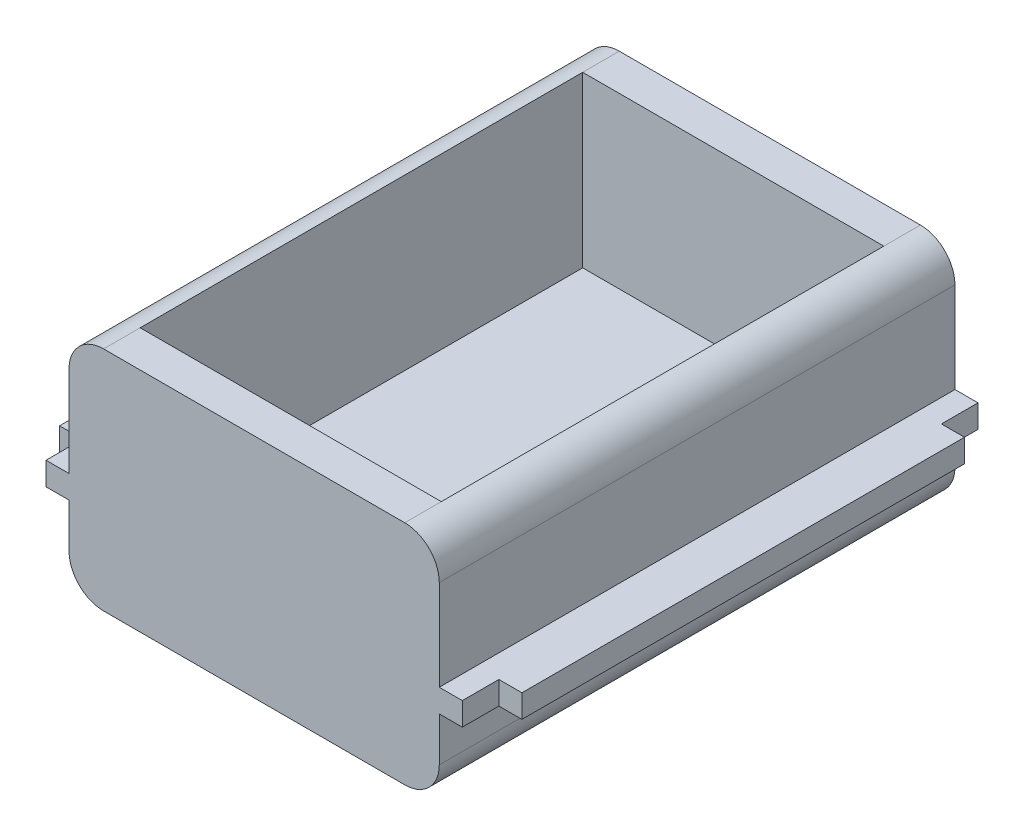
ISO-10303-21;
HEADER;
FILE_DESCRIPTION(('STEP AP214'),'2;1');
FILE_NAME('part.step','',(''),(''),'','','');
FILE_SCHEMA(('AUTOMOTIVE_DESIGN { 1 0 10303 214 1 1 1 1 }'));
ENDSEC;
DATA;
#1=APPLICATION_CONTEXT('core data for automotive mechanical design processes');
#2=APPLICATION_PROTOCOL_DEFINITION('international standard','automotive_design',2000,#1);
#3=PRODUCT_CONTEXT('',#1,'mechanical');
#4=PRODUCT('Part','Part','',(#3));
#5=PRODUCT_RELATED_PRODUCT_CATEGORY('part','',(#4));
#6=PRODUCT_DEFINITION_FORMATION('','',#4);
#7=PRODUCT_DEFINITION_CONTEXT('part definition',#1,'design');
#8=PRODUCT_DEFINITION('design','',#6,#7);
#9=PRODUCT_DEFINITION_SHAPE('','',#8);
#10=(LENGTH_UNIT() NAMED_UNIT(*) SI_UNIT(.MILLI.,.METRE.));
#11=(NAMED_UNIT(*) PLANE_ANGLE_UNIT() SI_UNIT($,.RADIAN.));
#12=(NAMED_UNIT(*) SI_UNIT($,.STERADIAN.) SOLID_ANGLE_UNIT());
#13=UNCERTAINTY_MEASURE_WITH_UNIT(LENGTH_MEASURE(1.E-05),#10,'distance_accuracy_value','');
#14=(GEOMETRIC_REPRESENTATION_CONTEXT(3) GLOBAL_UNCERTAINTY_ASSIGNED_CONTEXT((#13)) GLOBAL_UNIT_ASSIGNED_CONTEXT((#10,
#11,#12)) REPRESENTATION_CONTEXT('',''));
#15=CARTESIAN_POINT('',(0.,0.,0.));
#16=DIRECTION('',(0.,0.,1.));
#17=DIRECTION('',(1.,0.,0.));
#18=AXIS2_PLACEMENT_3D('',#15,#16,#17);
#19=CARTESIAN_POINT('',(18.0681626557431,-1.2537306370674E-13,290.56151375883));
#20=DIRECTION('',(-1.,0.,0.));
#21=DIRECTION('',(0.,-1.,0.));
#22=AXIS2_PLACEMENT_3D('',#19,#20,#21);
#23=PLANE('',#22);
#24=DIRECTION('',(0.,1.,0.));
#25=VECTOR('',#24,1.);
#26=CARTESIAN_POINT('',(18.068162655743,-17.709339043101,296.564940883577));
#27=LINE('',#26,#25);
#28=CARTESIAN_POINT('',(18.0681626557431,4.,296.564940883577));
#29=VERTEX_POINT('',#28);
#30=CARTESIAN_POINT('',(18.0681626557431,5.99999999999999,296.564940883577));
#31=VERTEX_POINT('',#30);
#32=EDGE_CURVE('E68',#29,#31,#27,.T.);
#33=ORIENTED_EDGE('',*,*,#32,.F.);
#34=DIRECTION('',(0.,0.,1.));
#35=VECTOR('',#34,1.);
#36=CARTESIAN_POINT('',(18.0681626557431,4.,290.56151375883));
#37=LINE('',#36,#35);
#38=CARTESIAN_POINT('',(18.0681626557431,4.,293.389940883577));
#39=VERTEX_POINT('',#38);
#40=EDGE_CURVE('E330',#39,#29,#37,.T.);
#41=ORIENTED_EDGE('',*,*,#40,.F.);
#42=DIRECTION('',(0.,-1.,0.));
#43=VECTOR('',#42,1.);
#44=CARTESIAN_POINT('',(18.0681626557431,-1.2537306370674E-13,293.389940883577));
#45=LINE('',#44,#43);
#46=CARTESIAN_POINT('',(18.0681626557432,6.,293.389940883577));
#47=VERTEX_POINT('',#46);
#48=EDGE_CURVE('E232',#47,#39,#45,.T.);
#49=ORIENTED_EDGE('',*,*,#48,.F.);
#50=DIRECTION('',(0.,0.,1.));
#51=VECTOR('',#50,1.);
#52=CARTESIAN_POINT('',(18.0681626557432,6.,290.56151375883));
#53=LINE('',#52,#51);
#54=EDGE_CURVE('E229',#47,#31,#53,.T.);
#55=ORIENTED_EDGE('',*,*,#54,.T.);
#56=EDGE_LOOP('',(#33,#41,#49,#55));
#57=FACE_BOUND('',#56,.T.);
#58=ADVANCED_FACE('F43',(#57),#23,.F.);
#59=CARTESIAN_POINT('',(-18.0681626557431,-1.2537306370674E-13,290.56151375883));
#60=DIRECTION('',(-1.,0.,0.));
#61=DIRECTION('',(0.,-1.,0.));
#62=AXIS2_PLACEMENT_3D('',#59,#60,#61);
#63=PLANE('',#62);
#64=DIRECTION('',(0.,0.,1.));
#65=VECTOR('',#64,1.);
#66=CARTESIAN_POINT('',(-18.0681626557431,4.,290.56151375883));
#67=LINE('',#66,#65);
#68=CARTESIAN_POINT('',(-18.0681626557431,4.,293.389940883577));
#69=VERTEX_POINT('',#68);
#70=CARTESIAN_POINT('',(-18.0681626557431,3.99999999999999,296.564940883577));
#71=VERTEX_POINT('',#70);
#72=EDGE_CURVE('E322',#69,#71,#67,.T.);
#73=ORIENTED_EDGE('',*,*,#72,.T.);
#74=DIRECTION('',(0.,1.,0.));
#75=VECTOR('',#74,1.);
#76=CARTESIAN_POINT('',(-18.068162655743,-17.7093390431007,296.564940883577));
#77=LINE('',#76,#75);
#78=CARTESIAN_POINT('',(-18.0681626557432,6.,296.564940883577));
#79=VERTEX_POINT('',#78);
#80=EDGE_CURVE('E285',#71,#79,#77,.T.);
#81=ORIENTED_EDGE('',*,*,#80,.T.);
#82=DIRECTION('',(0.,0.,1.));
#83=VECTOR('',#82,1.);
#84=CARTESIAN_POINT('',(-18.0681626557432,6.,290.56151375883));
#85=LINE('',#84,#83);
#86=CARTESIAN_POINT('',(-18.0681626557432,6.,293.389940883577));
#87=VERTEX_POINT('',#86);
#88=EDGE_CURVE('E310',#87,#79,#85,.T.);
#89=ORIENTED_EDGE('',*,*,#88,.F.);
#90=DIRECTION('',(0.,-1.,0.));
#91=VECTOR('',#90,1.);
#92=CARTESIAN_POINT('',(-18.0681626557431,-1.2537306370674E-13,293.389940883577));
#93=LINE('',#92,#91);
#94=EDGE_CURVE('E306',#87,#69,#93,.T.);
#95=ORIENTED_EDGE('',*,*,#94,.T.);
#96=EDGE_LOOP('',(#73,#81,#89,#95));
#97=FACE_BOUND('',#96,.T.);
#98=ADVANCED_FACE('F516',(#97),#63,.T.);
#99=CARTESIAN_POINT('',(16.0681626557431,0.,255.695244414574));
#100=DIRECTION('',(1.,0.,0.));
#101=DIRECTION('',(0.,0.,-1.));
#102=AXIS2_PLACEMENT_3D('',#99,#100,#101);
#103=PLANE('',#102);
#104=DIRECTION('',(0.,1.,0.));
#105=VECTOR('',#104,1.);
#106=CARTESIAN_POINT('',(16.0681626557431,0.,338.152440883577));
#107=LINE('',#106,#105);
#108=CARTESIAN_POINT('',(16.0681626557431,6.,338.152440883577));
#109=VERTEX_POINT('',#108);
#110=CARTESIAN_POINT('',(16.0681626557431,13.8673416006033,338.152440883577));
#111=VERTEX_POINT('',#110);
#112=EDGE_CURVE('E393',#109,#111,#107,.T.);
#113=ORIENTED_EDGE('',*,*,#112,.F.);
#114=DIRECTION('',(0.,0.,1.));
#115=VECTOR('',#114,1.);
#116=CARTESIAN_POINT('',(16.0681626557431,6.,290.56151375883));
#117=LINE('',#116,#115);
#118=CARTESIAN_POINT('',(16.0681626557431,6.,293.389940883577));
#119=VERTEX_POINT('',#118);
#120=EDGE_CURVE('E265',#119,#109,#117,.T.);
#121=ORIENTED_EDGE('',*,*,#120,.F.);
#122=DIRECTION('',(0.,1.,0.));
#123=VECTOR('',#122,1.);
#124=CARTESIAN_POINT('',(16.0681626557431,0.,293.389940883577));
#125=LINE('',#124,#123);
#126=CARTESIAN_POINT('',(16.0681626557431,13.8673416006033,293.389940883577));
#127=VERTEX_POINT('',#126);
#128=EDGE_CURVE('E411',#119,#127,#125,.T.);
#129=ORIENTED_EDGE('',*,*,#128,.T.);
#130=DIRECTION('',(0.,0.,1.));
#131=VECTOR('',#130,1.);
#132=CARTESIAN_POINT('',(16.0681626557431,13.8673416006033,255.695244414574));
#133=LINE('',#132,#131);
#134=EDGE_CURVE('E410',#127,#111,#133,.T.);
#135=ORIENTED_EDGE('',*,*,#134,.T.);
#136=EDGE_LOOP('',(#113,#121,#129,#135));
#137=FACE_BOUND('',#136,.T.);
#138=ADVANCED_FACE('F467',(#137),#103,.T.);
#139=CARTESIAN_POINT('',(16.0681626557431,0.165901618597167,293.389940883577));
#140=VERTEX_POINT('',#139);
#141=CARTESIAN_POINT('',(16.0681626557431,4.,293.389940883577));
#142=VERTEX_POINT('',#141);
#143=EDGE_CURVE('E407',#140,#142,#125,.T.);
#144=ORIENTED_EDGE('',*,*,#143,.T.);
#145=DIRECTION('',(0.,0.,1.));
#146=VECTOR('',#145,1.);
#147=CARTESIAN_POINT('',(16.0681626557431,4.,290.56151375883));
#148=LINE('',#147,#146);
#149=CARTESIAN_POINT('',(16.0681626557431,4.,338.152440883577));
#150=VERTEX_POINT('',#149);
#151=EDGE_CURVE('E329',#142,#150,#148,.T.);
#152=ORIENTED_EDGE('',*,*,#151,.T.);
#153=CARTESIAN_POINT('',(16.0681626557431,0.165901618597167,338.152440883577));
#154=VERTEX_POINT('',#153);
#155=EDGE_CURVE('E380',#154,#150,#107,.T.);
#156=ORIENTED_EDGE('',*,*,#155,.F.);
#157=DIRECTION('',(0.,0.,1.));
#158=VECTOR('',#157,1.);
#159=CARTESIAN_POINT('',(16.0681626557431,0.165901618597167,255.695244414574));
#160=LINE('',#159,#158);
#161=EDGE_CURVE('E403',#140,#154,#160,.T.);
#162=ORIENTED_EDGE('',*,*,#161,.F.);
#163=EDGE_LOOP('',(#144,#152,#156,#162));
#164=FACE_BOUND('',#163,.T.);
#165=ADVANCED_FACE('F474',(#164),#103,.T.);
#166=CARTESIAN_POINT('',(-16.0681626557431,0.,255.695244414574));
#167=DIRECTION('',(1.,0.,0.));
#168=DIRECTION('',(0.,0.,-1.));
#169=AXIS2_PLACEMENT_3D('',#166,#167,#168);
#170=PLANE('',#169);
#171=DIRECTION('',(0.,1.,0.));
#172=VECTOR('',#171,1.);
#173=CARTESIAN_POINT('',(-16.0681626557431,0.,338.152440883577));
#174=LINE('',#173,#172);
#175=CARTESIAN_POINT('',(-16.0681626557431,0.165901618597167,338.152440883577));
#176=VERTEX_POINT('',#175);
#177=CARTESIAN_POINT('',(-16.0681626557431,4.,338.152440883577));
#178=VERTEX_POINT('',#177);
#179=EDGE_CURVE('E384',#176,#178,#174,.T.);
#180=ORIENTED_EDGE('',*,*,#179,.T.);
#181=DIRECTION('',(0.,0.,1.));
#182=VECTOR('',#181,1.);
#183=CARTESIAN_POINT('',(-16.0681626557431,4.,290.56151375883));
#184=LINE('',#183,#182);
#185=CARTESIAN_POINT('',(-16.0681626557431,4.,293.389940883577));
#186=VERTEX_POINT('',#185);
#187=EDGE_CURVE('E305',#186,#178,#184,.T.);
#188=ORIENTED_EDGE('',*,*,#187,.F.);
#189=DIRECTION('',(0.,1.,0.));
#190=VECTOR('',#189,1.);
#191=CARTESIAN_POINT('',(-16.0681626557431,0.,293.389940883577));
#192=LINE('',#191,#190);
#193=CARTESIAN_POINT('',(-16.0681626557431,0.165901618597167,293.389940883577));
#194=VERTEX_POINT('',#193);
#195=EDGE_CURVE('E420',#194,#186,#192,.T.);
#196=ORIENTED_EDGE('',*,*,#195,.F.);
#197=DIRECTION('',(0.,0.,1.));
#198=VECTOR('',#197,1.);
#199=CARTESIAN_POINT('',(-16.0681626557431,0.165901618597167,255.695244414574));
#200=LINE('',#199,#198);
#201=EDGE_CURVE('E437',#194,#176,#200,.T.);
#202=ORIENTED_EDGE('',*,*,#201,.T.);
#203=EDGE_LOOP('',(#180,#188,#196,#202));
#204=FACE_BOUND('',#203,.T.);
#205=ADVANCED_FACE('F491',(#204),#170,.F.);
#206=CARTESIAN_POINT('',(0.,16.8673416006033,255.695244414574));
#207=DIRECTION('',(0.,-1.,0.));
#208=DIRECTION('',(0.,0.,-1.));
#209=AXIS2_PLACEMENT_3D('',#206,#207,#208);
#210=PLANE('',#209);
#211=DIRECTION('',(0.,0.,1.));
#212=VECTOR('',#211,1.);
#213=CARTESIAN_POINT('',(13.0681626557431,16.8673416006033,255.695244414574));
#214=LINE('',#213,#212);
#215=CARTESIAN_POINT('',(13.0681626557431,16.8673416006033,334.977440883576));
#216=VERTEX_POINT('',#215);
#217=CARTESIAN_POINT('',(13.0681626557431,16.8673416006033,338.152440883577));
#218=VERTEX_POINT('',#217);
#219=EDGE_CURVE('E427',#216,#218,#214,.T.);
#220=ORIENTED_EDGE('',*,*,#219,.F.);
#221=DIRECTION('',(1.,0.,0.));
#222=VECTOR('',#221,1.);
#223=CARTESIAN_POINT('',(-13.0681626557431,16.8673416006033,334.977440883576));
#224=LINE('',#223,#222);
#225=CARTESIAN_POINT('',(-13.0681626557431,16.8673416006033,334.977440883576));
#226=VERTEX_POINT('',#225);
#227=EDGE_CURVE('E348',#226,#216,#224,.T.);
#228=ORIENTED_EDGE('',*,*,#227,.F.);
#229=DIRECTION('',(0.,0.,1.));
#230=VECTOR('',#229,1.);
#231=CARTESIAN_POINT('',(-13.0681626557431,16.8673416006033,255.695244414574));
#232=LINE('',#231,#230);
#233=CARTESIAN_POINT('',(-13.0681626557431,16.8673416006033,338.152440883577));
#234=VERTEX_POINT('',#233);
#235=EDGE_CURVE('E428',#226,#234,#232,.T.);
#236=ORIENTED_EDGE('',*,*,#235,.T.);
#237=DIRECTION('',(1.,0.,0.));
#238=VECTOR('',#237,1.);
#239=CARTESIAN_POINT('',(0.,16.8673416006033,338.152440883577));
#240=LINE('',#239,#238);
#241=EDGE_CURVE('E376',#234,#218,#240,.T.);
#242=ORIENTED_EDGE('',*,*,#241,.T.);
#243=EDGE_LOOP('',(#220,#228,#236,#242));
#244=FACE_BOUND('',#243,.T.);
#245=ADVANCED_FACE('F585',(#244),#210,.F.);
#246=CARTESIAN_POINT('',(-13.0681626557431,13.8673416006033,255.695244414574));
#247=DIRECTION('',(0.,0.,1.));
#248=DIRECTION('',(1.,0.,0.));
#249=AXIS2_PLACEMENT_3D('',#246,#247,#248);
#250=CYLINDRICAL_SURFACE('',#249,3.);
#251=CARTESIAN_POINT('',(-13.0681626557431,13.8673416006033,293.389940883577));
#252=DIRECTION('',(0.,0.,-1.));
#253=DIRECTION('',(-1.,0.,0.));
#254=AXIS2_PLACEMENT_3D('',#251,#252,#253);
#255=CIRCLE('',#254,3.);
#256=CARTESIAN_POINT('',(-16.0681626557431,13.8673416006033,293.389940883577));
#257=VERTEX_POINT('',#256);
#258=CARTESIAN_POINT('',(-13.0681626557431,16.8673416006033,293.389940883577));
#259=VERTEX_POINT('',#258);
#260=EDGE_CURVE('E417',#257,#259,#255,.T.);
#261=ORIENTED_EDGE('',*,*,#260,.F.);
#262=DIRECTION('',(0.,0.,1.));
#263=VECTOR('',#262,1.);
#264=CARTESIAN_POINT('',(-16.0681626557431,13.8673416006033,255.695244414574));
#265=LINE('',#264,#263);
#266=CARTESIAN_POINT('',(-16.0681626557431,13.8673416006033,338.152440883577));
#267=VERTEX_POINT('',#266);
#268=EDGE_CURVE('E47',#257,#267,#265,.T.);
#269=ORIENTED_EDGE('',*,*,#268,.T.);
#270=CARTESIAN_POINT('',(-13.0681626557431,13.8673416006033,338.152440883577));
#271=DIRECTION('',(0.,0.,1.));
#272=DIRECTION('',(1.,0.,0.));
#273=AXIS2_PLACEMENT_3D('',#270,#271,#272);
#274=CIRCLE('',#273,3.);
#275=EDGE_CURVE('E381',#267,#234,#274,.F.);
#276=ORIENTED_EDGE('',*,*,#275,.T.);
#277=ORIENTED_EDGE('',*,*,#235,.F.);
#278=DIRECTION('',(0.,0.,1.));
#279=VECTOR('',#278,1.);
#280=CARTESIAN_POINT('',(-13.0681626557431,16.8673416006033,296.564940883576));
#281=LINE('',#280,#279);
#282=CARTESIAN_POINT('',(-13.0681626557431,16.8673416006033,296.564940883576));
#283=VERTEX_POINT('',#282);
#284=EDGE_CURVE('E350',#283,#226,#281,.T.);
#285=ORIENTED_EDGE('',*,*,#284,.F.);
#286=EDGE_CURVE('E424',#259,#283,#232,.T.);
#287=ORIENTED_EDGE('',*,*,#286,.F.);
#288=EDGE_LOOP('',(#261,#269,#276,#277,#285,#287));
#289=FACE_BOUND('',#288,.T.);
#290=ADVANCED_FACE('F452',(#289),#250,.T.);
#291=ORIENTED_EDGE('',*,*,#286,.T.);
#292=DIRECTION('',(-1.,0.,0.));
#293=VECTOR('',#292,1.);
#294=CARTESIAN_POINT('',(-13.0681626557431,16.8673416006033,296.564940883576));
#295=LINE('',#294,#293);
#296=CARTESIAN_POINT('',(13.0681626557431,16.8673416006033,296.564940883576));
#297=VERTEX_POINT('',#296);
#298=EDGE_CURVE('E325',#297,#283,#295,.T.);
#299=ORIENTED_EDGE('',*,*,#298,.F.);
#300=CARTESIAN_POINT('',(13.0681626557431,16.8673416006033,293.389940883577));
#301=VERTEX_POINT('',#300);
#302=EDGE_CURVE('E429',#301,#297,#214,.T.);
#303=ORIENTED_EDGE('',*,*,#302,.F.);
#304=DIRECTION('',(1.,0.,0.));
#305=VECTOR('',#304,1.);
#306=CARTESIAN_POINT('',(0.,16.8673416006033,293.389940883577));
#307=LINE('',#306,#305);
#308=EDGE_CURVE('E414',#259,#301,#307,.T.);
#309=ORIENTED_EDGE('',*,*,#308,.F.);
#310=EDGE_LOOP('',(#291,#299,#303,#309));
#311=FACE_BOUND('',#310,.T.);
#312=ADVANCED_FACE('F457',(#311),#210,.F.);
#313=CARTESIAN_POINT('',(13.0681626557431,13.8673416006033,255.695244414574));
#314=DIRECTION('',(0.,0.,1.));
#315=DIRECTION('',(1.,0.,0.));
#316=AXIS2_PLACEMENT_3D('',#313,#314,#315);
#317=CYLINDRICAL_SURFACE('',#316,3.);
#318=CARTESIAN_POINT('',(13.0681626557431,13.8673416006033,293.389940883577));
#319=DIRECTION('',(0.,0.,-1.));
#320=DIRECTION('',(-1.,0.,0.));
#321=AXIS2_PLACEMENT_3D('',#318,#319,#320);
#322=CIRCLE('',#321,3.);
#323=EDGE_CURVE('E406',#301,#127,#322,.T.);
#324=ORIENTED_EDGE('',*,*,#323,.F.);
#325=ORIENTED_EDGE('',*,*,#302,.T.);
#326=DIRECTION('',(0.,0.,-1.));
#327=VECTOR('',#326,1.);
#328=CARTESIAN_POINT('',(13.0681626557431,16.8673416006033,296.564940883576));
#329=LINE('',#328,#327);
#330=EDGE_CURVE('E344',#216,#297,#329,.T.);
#331=ORIENTED_EDGE('',*,*,#330,.F.);
#332=ORIENTED_EDGE('',*,*,#219,.T.);
#333=CARTESIAN_POINT('',(13.0681626557431,13.8673416006033,338.152440883577));
#334=DIRECTION('',(0.,0.,1.));
#335=DIRECTION('',(1.,0.,0.));
#336=AXIS2_PLACEMENT_3D('',#333,#334,#335);
#337=CIRCLE('',#336,3.);
#338=EDGE_CURVE('E379',#218,#111,#337,.F.);
#339=ORIENTED_EDGE('',*,*,#338,.T.);
#340=ORIENTED_EDGE('',*,*,#134,.F.);
#341=EDGE_LOOP('',(#324,#325,#331,#332,#339,#340));
#342=FACE_BOUND('',#341,.T.);
#343=ADVANCED_FACE('F462',(#342),#317,.T.);
#344=CARTESIAN_POINT('',(13.0681626557431,0.165901618597167,255.695244414574));
#345=DIRECTION('',(0.,0.,1.));
#346=DIRECTION('',(1.,0.,0.));
#347=AXIS2_PLACEMENT_3D('',#344,#345,#346);
#348=CYLINDRICAL_SURFACE('',#347,3.);
#349=CARTESIAN_POINT('',(13.0681626557431,0.165901618597167,293.389940883577));
#350=DIRECTION('',(0.,0.,-1.));
#351=DIRECTION('',(-1.,0.,0.));
#352=AXIS2_PLACEMENT_3D('',#349,#350,#351);
#353=CIRCLE('',#352,3.);
#354=CARTESIAN_POINT('',(13.0681626557431,-2.83409838140283,293.389940883577));
#355=VERTEX_POINT('',#354);
#356=EDGE_CURVE('E52',#140,#355,#353,.T.);
#357=ORIENTED_EDGE('',*,*,#356,.F.);
#358=ORIENTED_EDGE('',*,*,#161,.T.);
#359=CARTESIAN_POINT('',(13.0681626557431,0.165901618597167,338.152440883577));
#360=DIRECTION('',(0.,0.,1.));
#361=DIRECTION('',(1.,0.,0.));
#362=AXIS2_PLACEMENT_3D('',#359,#360,#361);
#363=CIRCLE('',#362,3.);
#364=CARTESIAN_POINT('',(13.0681626557431,-2.83409838140283,338.152440883577));
#365=VERTEX_POINT('',#364);
#366=EDGE_CURVE('E390',#154,#365,#363,.F.);
#367=ORIENTED_EDGE('',*,*,#366,.T.);
#368=DIRECTION('',(0.,0.,1.));
#369=VECTOR('',#368,1.);
#370=CARTESIAN_POINT('',(13.0681626557431,-2.83409838140283,255.695244414574));
#371=LINE('',#370,#369);
#372=EDGE_CURVE('E402',#355,#365,#371,.T.);
#373=ORIENTED_EDGE('',*,*,#372,.F.);
#374=EDGE_LOOP('',(#357,#358,#367,#373));
#375=FACE_BOUND('',#374,.T.);
#376=ADVANCED_FACE('F478',(#375),#348,.T.);
#377=CARTESIAN_POINT('',(0.,-2.83409838140283,255.695244414574));
#378=DIRECTION('',(0.,-1.,0.));
#379=DIRECTION('',(0.,0.,-1.));
#380=AXIS2_PLACEMENT_3D('',#377,#378,#379);
#381=PLANE('',#380);
#382=DIRECTION('',(0.,0.,1.));
#383=VECTOR('',#382,1.);
#384=CARTESIAN_POINT('',(-13.0681626557431,-2.83409838140283,255.695244414574));
#385=LINE('',#384,#383);
#386=CARTESIAN_POINT('',(-13.0681626557431,-2.83409838140283,293.389940883577));
#387=VERTEX_POINT('',#386);
#388=CARTESIAN_POINT('',(-13.0681626557431,-2.83409838140283,338.152440883577));
#389=VERTEX_POINT('',#388);
#390=EDGE_CURVE('E436',#387,#389,#385,.T.);
#391=ORIENTED_EDGE('',*,*,#390,.F.);
#392=DIRECTION('',(1.,0.,0.));
#393=VECTOR('',#392,1.);
#394=CARTESIAN_POINT('',(0.,-2.83409838140283,293.389940883577));
#395=LINE('',#394,#393);
#396=EDGE_CURVE('E400',#387,#355,#395,.T.);
#397=ORIENTED_EDGE('',*,*,#396,.T.);
#398=ORIENTED_EDGE('',*,*,#372,.T.);
#399=DIRECTION('',(1.,0.,0.));
#400=VECTOR('',#399,1.);
#401=CARTESIAN_POINT('',(0.,-2.83409838140283,338.152440883577));
#402=LINE('',#401,#400);
#403=EDGE_CURVE('E375',#389,#365,#402,.T.);
#404=ORIENTED_EDGE('',*,*,#403,.F.);
#405=EDGE_LOOP('',(#391,#397,#398,#404));
#406=FACE_BOUND('',#405,.T.);
#407=ADVANCED_FACE('F487',(#406),#381,.T.);
#408=CARTESIAN_POINT('',(-13.0681626557431,0.165901618597167,255.695244414574));
#409=DIRECTION('',(0.,0.,1.));
#410=DIRECTION('',(1.,0.,0.));
#411=AXIS2_PLACEMENT_3D('',#408,#409,#410);
#412=CYLINDRICAL_SURFACE('',#411,3.);
#413=CARTESIAN_POINT('',(-13.0681626557431,0.165901618597167,293.389940883577));
#414=DIRECTION('',(0.,0.,-1.));
#415=DIRECTION('',(-1.,0.,0.));
#416=AXIS2_PLACEMENT_3D('',#413,#414,#415);
#417=CIRCLE('',#416,3.);
#418=EDGE_CURVE('E12',#387,#194,#417,.T.);
#419=ORIENTED_EDGE('',*,*,#418,.F.);
#420=ORIENTED_EDGE('',*,*,#390,.T.);
#421=CARTESIAN_POINT('',(-13.0681626557431,0.165901618597167,338.152440883577));
#422=DIRECTION('',(0.,0.,1.));
#423=DIRECTION('',(1.,0.,0.));
#424=AXIS2_PLACEMENT_3D('',#421,#422,#423);
#425=CIRCLE('',#424,3.);
#426=EDGE_CURVE('E387',#389,#176,#425,.F.);
#427=ORIENTED_EDGE('',*,*,#426,.T.);
#428=ORIENTED_EDGE('',*,*,#201,.F.);
#429=EDGE_LOOP('',(#419,#420,#427,#428));
#430=FACE_BOUND('',#429,.T.);
#431=ADVANCED_FACE('F490',(#430),#412,.T.);
#432=CARTESIAN_POINT('',(-16.0681626557431,5.99999999999999,293.389940883577));
#433=VERTEX_POINT('',#432);
#434=EDGE_CURVE('E423',#433,#257,#192,.T.);
#435=ORIENTED_EDGE('',*,*,#434,.F.);
#436=DIRECTION('',(0.,0.,1.));
#437=VECTOR('',#436,1.);
#438=CARTESIAN_POINT('',(-16.0681626557431,6.,290.56151375883));
#439=LINE('',#438,#437);
#440=CARTESIAN_POINT('',(-16.0681626557431,6.,338.152440883577));
#441=VERTEX_POINT('',#440);
#442=EDGE_CURVE('E315',#433,#441,#439,.T.);
#443=ORIENTED_EDGE('',*,*,#442,.T.);
#444=EDGE_CURVE('E386',#441,#267,#174,.T.);
#445=ORIENTED_EDGE('',*,*,#444,.T.);
#446=ORIENTED_EDGE('',*,*,#268,.F.);
#447=EDGE_LOOP('',(#435,#443,#445,#446));
#448=FACE_BOUND('',#447,.T.);
#449=ADVANCED_FACE('F448',(#448),#170,.F.);
#450=CARTESIAN_POINT('',(-22.376728314293,-17.7093390431007,293.389940883577));
#451=DIRECTION('',(0.,0.,-1.));
#452=DIRECTION('',(-1.,0.,0.));
#453=AXIS2_PLACEMENT_3D('',#450,#451,#452);
#454=PLANE('',#453);
#455=ORIENTED_EDGE('',*,*,#195,.T.);
#456=DIRECTION('',(1.,0.,0.));
#457=VECTOR('',#456,1.);
#458=CARTESIAN_POINT('',(0.,4.,293.389940883577));
#459=LINE('',#458,#457);
#460=EDGE_CURVE('E295',#69,#186,#459,.T.);
#461=ORIENTED_EDGE('',*,*,#460,.F.);
#462=ORIENTED_EDGE('',*,*,#94,.F.);
#463=DIRECTION('',(-1.,0.,0.));
#464=VECTOR('',#463,1.);
#465=CARTESIAN_POINT('',(0.,6.00000000000001,293.389940883577));
#466=LINE('',#465,#464);
#467=EDGE_CURVE('E311',#433,#87,#466,.T.);
#468=ORIENTED_EDGE('',*,*,#467,.F.);
#469=ORIENTED_EDGE('',*,*,#434,.T.);
#470=ORIENTED_EDGE('',*,*,#260,.T.);
#471=ORIENTED_EDGE('',*,*,#308,.T.);
#472=ORIENTED_EDGE('',*,*,#323,.T.);
#473=ORIENTED_EDGE('',*,*,#128,.F.);
#474=DIRECTION('',(1.,0.,0.));
#475=VECTOR('',#474,1.);
#476=CARTESIAN_POINT('',(0.,6.00000000000001,293.389940883577));
#477=LINE('',#476,#475);
#478=EDGE_CURVE('E337',#119,#47,#477,.T.);
#479=ORIENTED_EDGE('',*,*,#478,.T.);
#480=ORIENTED_EDGE('',*,*,#48,.T.);
#481=DIRECTION('',(-1.,0.,0.));
#482=VECTOR('',#481,1.);
#483=CARTESIAN_POINT('',(0.,4.,293.389940883577));
#484=LINE('',#483,#482);
#485=EDGE_CURVE('E302',#39,#142,#484,.T.);
#486=ORIENTED_EDGE('',*,*,#485,.T.);
#487=ORIENTED_EDGE('',*,*,#143,.F.);
#488=ORIENTED_EDGE('',*,*,#356,.T.);
#489=ORIENTED_EDGE('',*,*,#396,.F.);
#490=ORIENTED_EDGE('',*,*,#418,.T.);
#491=EDGE_LOOP('',(#455,#461,#462,#468,#469,#470,#471,#472,#473,#479,#480,#486,#487,#488,#489,#490));
#492=FACE_BOUND('',#491,.T.);
#493=ADVANCED_FACE('F45',(#492),#454,.T.);
#494=CARTESIAN_POINT('',(-1.81043795684957,9.1501579017386,338.152440883577));
#495=DIRECTION('',(0.,0.,1.));
#496=DIRECTION('',(1.,0.,0.));
#497=AXIS2_PLACEMENT_3D('',#494,#495,#496);
#498=PLANE('',#497);
#499=ORIENTED_EDGE('',*,*,#275,.F.);
#500=ORIENTED_EDGE('',*,*,#444,.F.);
#501=DIRECTION('',(-1.,0.,0.));
#502=VECTOR('',#501,1.);
#503=CARTESIAN_POINT('',(0.,6.00000000000001,338.152440883577));
#504=LINE('',#503,#502);
#505=CARTESIAN_POINT('',(-18.0681626557432,6.,338.152440883577));
#506=VERTEX_POINT('',#505);
#507=EDGE_CURVE('E292',#441,#506,#504,.T.);
#508=ORIENTED_EDGE('',*,*,#507,.T.);
#509=DIRECTION('',(0.,-1.,0.));
#510=VECTOR('',#509,1.);
#511=CARTESIAN_POINT('',(-18.0681626557431,-1.2537306370674E-13,338.152440883577));
#512=LINE('',#511,#510);
#513=CARTESIAN_POINT('',(-18.0681626557431,4.,338.152440883577));
#514=VERTEX_POINT('',#513);
#515=EDGE_CURVE('E299',#506,#514,#512,.T.);
#516=ORIENTED_EDGE('',*,*,#515,.T.);
#517=DIRECTION('',(1.,0.,0.));
#518=VECTOR('',#517,1.);
#519=CARTESIAN_POINT('',(0.,4.,338.152440883577));
#520=LINE('',#519,#518);
#521=EDGE_CURVE('E296',#514,#178,#520,.T.);
#522=ORIENTED_EDGE('',*,*,#521,.T.);
#523=ORIENTED_EDGE('',*,*,#179,.F.);
#524=ORIENTED_EDGE('',*,*,#426,.F.);
#525=ORIENTED_EDGE('',*,*,#403,.T.);
#526=ORIENTED_EDGE('',*,*,#366,.F.);
#527=ORIENTED_EDGE('',*,*,#155,.T.);
#528=DIRECTION('',(-1.,0.,0.));
#529=VECTOR('',#528,1.);
#530=CARTESIAN_POINT('',(0.,4.,338.152440883577));
#531=LINE('',#530,#529);
#532=CARTESIAN_POINT('',(18.0681626557431,4.,338.152440883577));
#533=VERTEX_POINT('',#532);
#534=EDGE_CURVE('E327',#533,#150,#531,.T.);
#535=ORIENTED_EDGE('',*,*,#534,.F.);
#536=DIRECTION('',(0.,-1.,0.));
#537=VECTOR('',#536,1.);
#538=CARTESIAN_POINT('',(18.0681626557431,-1.2537306370674E-13,338.152440883577));
#539=LINE('',#538,#537);
#540=CARTESIAN_POINT('',(18.0681626557432,6.,338.152440883577));
#541=VERTEX_POINT('',#540);
#542=EDGE_CURVE('E235',#541,#533,#539,.T.);
#543=ORIENTED_EDGE('',*,*,#542,.F.);
#544=DIRECTION('',(1.,0.,0.));
#545=VECTOR('',#544,1.);
#546=CARTESIAN_POINT('',(0.,6.00000000000001,338.152440883577));
#547=LINE('',#546,#545);
#548=EDGE_CURVE('E331',#109,#541,#547,.T.);
#549=ORIENTED_EDGE('',*,*,#548,.F.);
#550=ORIENTED_EDGE('',*,*,#112,.T.);
#551=ORIENTED_EDGE('',*,*,#338,.F.);
#552=ORIENTED_EDGE('',*,*,#241,.F.);
#553=EDGE_LOOP('',(#499,#500,#508,#516,#522,#523,#524,#525,#526,#527,#535,#543,#549,#550,#551,#552));
#554=FACE_BOUND('',#553,.T.);
#555=ADVANCED_FACE('F481',(#554),#498,.T.);
#556=CARTESIAN_POINT('',(0.,2.16590161859717,255.695244414574));
#557=DIRECTION('',(0.,-1.,0.));
#558=DIRECTION('',(0.,0.,-1.));
#559=AXIS2_PLACEMENT_3D('',#556,#557,#558);
#560=PLANE('',#559);
#561=DIRECTION('',(-1.,0.,0.));
#562=VECTOR('',#561,1.);
#563=CARTESIAN_POINT('',(-13.0681626557431,2.16590161859716,296.564940883576));
#564=LINE('',#563,#562);
#565=CARTESIAN_POINT('',(13.0681626557431,2.16590161859716,296.564940883576));
#566=VERTEX_POINT('',#565);
#567=CARTESIAN_POINT('',(-13.0681626557431,2.16590161859716,296.564940883576));
#568=VERTEX_POINT('',#567);
#569=EDGE_CURVE('E358',#566,#568,#564,.T.);
#570=ORIENTED_EDGE('',*,*,#569,.T.);
#571=DIRECTION('',(0.,0.,1.));
#572=VECTOR('',#571,1.);
#573=CARTESIAN_POINT('',(-13.0681626557431,2.16590161859716,296.564940883576));
#574=LINE('',#573,#572);
#575=CARTESIAN_POINT('',(-13.0681626557431,2.16590161859716,334.977440883576));
#576=VERTEX_POINT('',#575);
#577=EDGE_CURVE('E347',#568,#576,#574,.T.);
#578=ORIENTED_EDGE('',*,*,#577,.T.);
#579=DIRECTION('',(1.,0.,0.));
#580=VECTOR('',#579,1.);
#581=CARTESIAN_POINT('',(-13.0681626557431,2.16590161859716,334.977440883576));
#582=LINE('',#581,#580);
#583=CARTESIAN_POINT('',(13.0681626557431,2.16590161859716,334.977440883576));
#584=VERTEX_POINT('',#583);
#585=EDGE_CURVE('E367',#576,#584,#582,.T.);
#586=ORIENTED_EDGE('',*,*,#585,.T.);
#587=DIRECTION('',(0.,0.,-1.));
#588=VECTOR('',#587,1.);
#589=CARTESIAN_POINT('',(13.0681626557431,2.16590161859716,296.564940883576));
#590=LINE('',#589,#588);
#591=EDGE_CURVE('E363',#584,#566,#590,.T.);
#592=ORIENTED_EDGE('',*,*,#591,.T.);
#593=EDGE_LOOP('',(#570,#578,#586,#592));
#594=FACE_BOUND('',#593,.T.);
#595=ADVANCED_FACE('F566',(#594),#560,.F.);
#596=CARTESIAN_POINT('',(-13.0681626557431,-49.2951321305333,296.564940883576));
#597=DIRECTION('',(-1.,0.,0.));
#598=DIRECTION('',(0.,0.,1.));
#599=AXIS2_PLACEMENT_3D('',#596,#597,#598);
#600=PLANE('',#599);
#601=DIRECTION('',(0.,1.,0.));
#602=VECTOR('',#601,1.);
#603=CARTESIAN_POINT('',(-13.0681626557431,-49.2951321305333,296.564940883576));
#604=LINE('',#603,#602);
#605=EDGE_CURVE('E361',#568,#283,#604,.T.);
#606=ORIENTED_EDGE('',*,*,#605,.T.);
#607=ORIENTED_EDGE('',*,*,#284,.T.);
#608=DIRECTION('',(0.,1.,0.));
#609=VECTOR('',#608,1.);
#610=CARTESIAN_POINT('',(-13.0681626557431,-49.2951321305333,334.977440883576));
#611=LINE('',#610,#609);
#612=EDGE_CURVE('E357',#576,#226,#611,.T.);
#613=ORIENTED_EDGE('',*,*,#612,.F.);
#614=ORIENTED_EDGE('',*,*,#577,.F.);
#615=EDGE_LOOP('',(#606,#607,#613,#614));
#616=FACE_BOUND('',#615,.T.);
#617=ADVANCED_FACE('F562',(#616),#600,.F.);
#618=CARTESIAN_POINT('',(-13.0681626557431,-49.2951321305333,334.977440883576));
#619=DIRECTION('',(0.,0.,1.));
#620=DIRECTION('',(1.,0.,0.));
#621=AXIS2_PLACEMENT_3D('',#618,#619,#620);
#622=PLANE('',#621);
#623=ORIENTED_EDGE('',*,*,#612,.T.);
#624=ORIENTED_EDGE('',*,*,#227,.T.);
#625=DIRECTION('',(0.,1.,0.));
#626=VECTOR('',#625,1.);
#627=CARTESIAN_POINT('',(13.0681626557431,-49.2951321305333,334.977440883576));
#628=LINE('',#627,#626);
#629=EDGE_CURVE('E366',#584,#216,#628,.T.);
#630=ORIENTED_EDGE('',*,*,#629,.F.);
#631=ORIENTED_EDGE('',*,*,#585,.F.);
#632=EDGE_LOOP('',(#623,#624,#630,#631));
#633=FACE_BOUND('',#632,.T.);
#634=ADVANCED_FACE('F558',(#633),#622,.F.);
#635=CARTESIAN_POINT('',(13.0681626557431,-49.2951321305333,296.564940883576));
#636=DIRECTION('',(1.,0.,0.));
#637=DIRECTION('',(0.,0.,-1.));
#638=AXIS2_PLACEMENT_3D('',#635,#636,#637);
#639=PLANE('',#638);
#640=ORIENTED_EDGE('',*,*,#629,.T.);
#641=ORIENTED_EDGE('',*,*,#330,.T.);
#642=DIRECTION('',(0.,1.,0.));
#643=VECTOR('',#642,1.);
#644=CARTESIAN_POINT('',(13.0681626557431,-49.2951321305333,296.564940883576));
#645=LINE('',#644,#643);
#646=EDGE_CURVE('E362',#566,#297,#645,.T.);
#647=ORIENTED_EDGE('',*,*,#646,.F.);
#648=ORIENTED_EDGE('',*,*,#591,.F.);
#649=EDGE_LOOP('',(#640,#641,#647,#648));
#650=FACE_BOUND('',#649,.T.);
#651=ADVANCED_FACE('F552',(#650),#639,.F.);
#652=CARTESIAN_POINT('',(-13.0681626557431,-49.2951321305333,296.564940883576));
#653=DIRECTION('',(0.,0.,-1.));
#654=DIRECTION('',(-1.,0.,0.));
#655=AXIS2_PLACEMENT_3D('',#652,#653,#654);
#656=PLANE('',#655);
#657=ORIENTED_EDGE('',*,*,#646,.T.);
#658=ORIENTED_EDGE('',*,*,#298,.T.);
#659=ORIENTED_EDGE('',*,*,#605,.F.);
#660=ORIENTED_EDGE('',*,*,#569,.F.);
#661=EDGE_LOOP('',(#657,#658,#659,#660));
#662=FACE_BOUND('',#661,.T.);
#663=ADVANCED_FACE('F548',(#662),#656,.F.);
#664=CARTESIAN_POINT('',(0.,6.00000000000001,290.56151375883));
#665=DIRECTION('',(0.,-1.,0.));
#666=DIRECTION('',(1.,0.,0.));
#667=AXIS2_PLACEMENT_3D('',#664,#665,#666);
#668=PLANE('',#667);
#669=ORIENTED_EDGE('',*,*,#478,.F.);
#670=ORIENTED_EDGE('',*,*,#120,.T.);
#671=ORIENTED_EDGE('',*,*,#548,.T.);
#672=CARTESIAN_POINT('',(18.0681626557432,6.,334.977440883577));
#673=VERTEX_POINT('',#672);
#674=EDGE_CURVE('E236',#673,#541,#53,.T.);
#675=ORIENTED_EDGE('',*,*,#674,.F.);
#676=DIRECTION('',(-1.,0.,0.));
#677=VECTOR('',#676,1.);
#678=CARTESIAN_POINT('',(-22.376728314293,6.00000000000001,334.977440883577));
#679=LINE('',#678,#677);
#680=CARTESIAN_POINT('',(20.0681626557432,5.99999999999999,334.977440883577));
#681=VERTEX_POINT('',#680);
#682=EDGE_CURVE('E266',#681,#673,#679,.T.);
#683=ORIENTED_EDGE('',*,*,#682,.F.);
#684=DIRECTION('',(0.,0.,-1.));
#685=VECTOR('',#684,1.);
#686=CARTESIAN_POINT('',(20.0681626557432,5.99999999999999,337.805868008323));
#687=LINE('',#686,#685);
#688=CARTESIAN_POINT('',(20.0681626557432,5.99999999999999,296.564940883577));
#689=VERTEX_POINT('',#688);
#690=EDGE_CURVE('E243',#681,#689,#687,.T.);
#691=ORIENTED_EDGE('',*,*,#690,.T.);
#692=DIRECTION('',(-1.,0.,0.));
#693=VECTOR('',#692,1.);
#694=CARTESIAN_POINT('',(-22.376728314293,6.00000000000001,296.564940883577));
#695=LINE('',#694,#693);
#696=EDGE_CURVE('E239',#689,#31,#695,.T.);
#697=ORIENTED_EDGE('',*,*,#696,.T.);
#698=ORIENTED_EDGE('',*,*,#54,.F.);
#699=EDGE_LOOP('',(#669,#670,#671,#675,#683,#691,#697,#698));
#700=FACE_BOUND('',#699,.T.);
#701=ADVANCED_FACE('F240',(#700),#668,.F.);
#702=CARTESIAN_POINT('',(18.0681626557431,4.,334.977440883577));
#703=VERTEX_POINT('',#702);
#704=EDGE_CURVE('E60',#703,#533,#37,.T.);
#705=ORIENTED_EDGE('',*,*,#704,.F.);
#706=DIRECTION('',(0.,1.,0.));
#707=VECTOR('',#706,1.);
#708=CARTESIAN_POINT('',(18.068162655743,-17.709339043101,334.977440883577));
#709=LINE('',#708,#707);
#710=EDGE_CURVE('E267',#703,#673,#709,.T.);
#711=ORIENTED_EDGE('',*,*,#710,.T.);
#712=ORIENTED_EDGE('',*,*,#674,.T.);
#713=ORIENTED_EDGE('',*,*,#542,.T.);
#714=EDGE_LOOP('',(#705,#711,#712,#713));
#715=FACE_BOUND('',#714,.T.);
#716=ADVANCED_FACE('F534',(#715),#23,.F.);
#717=CARTESIAN_POINT('',(0.,4.,290.56151375883));
#718=DIRECTION('',(0.,1.,0.));
#719=DIRECTION('',(0.,0.,1.));
#720=AXIS2_PLACEMENT_3D('',#717,#718,#719);
#721=PLANE('',#720);
#722=ORIENTED_EDGE('',*,*,#485,.F.);
#723=ORIENTED_EDGE('',*,*,#40,.T.);
#724=DIRECTION('',(-1.,0.,0.));
#725=VECTOR('',#724,1.);
#726=CARTESIAN_POINT('',(-22.376728314293,4.00000000000001,296.564940883577));
#727=LINE('',#726,#725);
#728=CARTESIAN_POINT('',(20.0681626557432,4.,296.564940883577));
#729=VERTEX_POINT('',#728);
#730=EDGE_CURVE('E252',#729,#29,#727,.T.);
#731=ORIENTED_EDGE('',*,*,#730,.F.);
#732=DIRECTION('',(0.,0.,-1.));
#733=VECTOR('',#732,1.);
#734=CARTESIAN_POINT('',(20.0681626557432,4.,337.805868008323));
#735=LINE('',#734,#733);
#736=CARTESIAN_POINT('',(20.0681626557432,4.,334.977440883577));
#737=VERTEX_POINT('',#736);
#738=EDGE_CURVE('E260',#737,#729,#735,.T.);
#739=ORIENTED_EDGE('',*,*,#738,.F.);
#740=DIRECTION('',(-1.,0.,0.));
#741=VECTOR('',#740,1.);
#742=CARTESIAN_POINT('',(-22.376728314293,4.00000000000001,334.977440883577));
#743=LINE('',#742,#741);
#744=EDGE_CURVE('E262',#737,#703,#743,.T.);
#745=ORIENTED_EDGE('',*,*,#744,.T.);
#746=ORIENTED_EDGE('',*,*,#704,.T.);
#747=ORIENTED_EDGE('',*,*,#534,.T.);
#748=ORIENTED_EDGE('',*,*,#151,.F.);
#749=EDGE_LOOP('',(#722,#723,#731,#739,#745,#746,#747,#748));
#750=FACE_BOUND('',#749,.T.);
#751=ADVANCED_FACE('F543',(#750),#721,.F.);
#752=CARTESIAN_POINT('',(0.,4.,290.56151375883));
#753=DIRECTION('',(0.,-1.,0.));
#754=DIRECTION('',(0.,0.,-1.));
#755=AXIS2_PLACEMENT_3D('',#752,#753,#754);
#756=PLANE('',#755);
#757=ORIENTED_EDGE('',*,*,#72,.F.);
#758=ORIENTED_EDGE('',*,*,#460,.T.);
#759=ORIENTED_EDGE('',*,*,#187,.T.);
#760=ORIENTED_EDGE('',*,*,#521,.F.);
#761=CARTESIAN_POINT('',(-18.0681626557431,3.99999999999999,334.977440883577));
#762=VERTEX_POINT('',#761);
#763=EDGE_CURVE('E309',#762,#514,#67,.T.);
#764=ORIENTED_EDGE('',*,*,#763,.F.);
#765=DIRECTION('',(1.,0.,0.));
#766=VECTOR('',#765,1.);
#767=CARTESIAN_POINT('',(-22.376728314293,3.99999999999999,334.977440883577));
#768=LINE('',#767,#766);
#769=CARTESIAN_POINT('',(-20.0681626557432,3.99999999999999,334.977440883577));
#770=VERTEX_POINT('',#769);
#771=EDGE_CURVE('E269',#770,#762,#768,.T.);
#772=ORIENTED_EDGE('',*,*,#771,.F.);
#773=DIRECTION('',(0.,0.,-1.));
#774=VECTOR('',#773,1.);
#775=CARTESIAN_POINT('',(-20.0681626557432,3.99999999999999,337.805868008323));
#776=LINE('',#775,#774);
#777=CARTESIAN_POINT('',(-20.0681626557432,3.99999999999999,296.564940883577));
#778=VERTEX_POINT('',#777);
#779=EDGE_CURVE('E279',#770,#778,#776,.T.);
#780=ORIENTED_EDGE('',*,*,#779,.T.);
#781=DIRECTION('',(1.,0.,0.));
#782=VECTOR('',#781,1.);
#783=CARTESIAN_POINT('',(-22.376728314293,3.99999999999999,296.564940883577));
#784=LINE('',#783,#782);
#785=EDGE_CURVE('E281',#778,#71,#784,.T.);
#786=ORIENTED_EDGE('',*,*,#785,.T.);
#787=EDGE_LOOP('',(#757,#758,#759,#760,#764,#772,#780,#786));
#788=FACE_BOUND('',#787,.T.);
#789=ADVANCED_FACE('F495',(#788),#756,.T.);
#790=CARTESIAN_POINT('',(0.,6.00000000000001,290.56151375883));
#791=DIRECTION('',(0.,1.,0.));
#792=DIRECTION('',(-1.,0.,0.));
#793=AXIS2_PLACEMENT_3D('',#790,#791,#792);
#794=PLANE('',#793);
#795=ORIENTED_EDGE('',*,*,#442,.F.);
#796=ORIENTED_EDGE('',*,*,#467,.T.);
#797=ORIENTED_EDGE('',*,*,#88,.T.);
#798=DIRECTION('',(1.,0.,0.));
#799=VECTOR('',#798,1.);
#800=CARTESIAN_POINT('',(-22.376728314293,5.99999999999999,296.564940883577));
#801=LINE('',#800,#799);
#802=CARTESIAN_POINT('',(-20.0681626557432,5.99999999999999,296.564940883577));
#803=VERTEX_POINT('',#802);
#804=EDGE_CURVE('E283',#803,#79,#801,.T.);
#805=ORIENTED_EDGE('',*,*,#804,.F.);
#806=DIRECTION('',(0.,0.,-1.));
#807=VECTOR('',#806,1.);
#808=CARTESIAN_POINT('',(-20.0681626557432,5.99999999999999,337.805868008323));
#809=LINE('',#808,#807);
#810=CARTESIAN_POINT('',(-20.0681626557432,5.99999999999999,334.977440883577));
#811=VERTEX_POINT('',#810);
#812=EDGE_CURVE('E276',#811,#803,#809,.T.);
#813=ORIENTED_EDGE('',*,*,#812,.F.);
#814=DIRECTION('',(1.,0.,0.));
#815=VECTOR('',#814,1.);
#816=CARTESIAN_POINT('',(-22.376728314293,5.99999999999999,334.977440883577));
#817=LINE('',#816,#815);
#818=CARTESIAN_POINT('',(-18.0681626557432,6.,334.977440883577));
#819=VERTEX_POINT('',#818);
#820=EDGE_CURVE('E247',#811,#819,#817,.T.);
#821=ORIENTED_EDGE('',*,*,#820,.T.);
#822=EDGE_CURVE('E314',#819,#506,#85,.T.);
#823=ORIENTED_EDGE('',*,*,#822,.T.);
#824=ORIENTED_EDGE('',*,*,#507,.F.);
#825=EDGE_LOOP('',(#795,#796,#797,#805,#813,#821,#823,#824));
#826=FACE_BOUND('',#825,.T.);
#827=ADVANCED_FACE('F519',(#826),#794,.T.);
#828=DIRECTION('',(0.,1.,0.));
#829=VECTOR('',#828,1.);
#830=CARTESIAN_POINT('',(-18.068162655743,-17.7093390431007,334.977440883577));
#831=LINE('',#830,#829);
#832=EDGE_CURVE('E272',#762,#819,#831,.T.);
#833=ORIENTED_EDGE('',*,*,#832,.F.);
#834=ORIENTED_EDGE('',*,*,#763,.T.);
#835=ORIENTED_EDGE('',*,*,#515,.F.);
#836=ORIENTED_EDGE('',*,*,#822,.F.);
#837=EDGE_LOOP('',(#833,#834,#835,#836));
#838=FACE_BOUND('',#837,.T.);
#839=ADVANCED_FACE('F502',(#838),#63,.T.);
#840=CARTESIAN_POINT('',(-20.0681626557432,-17.7093390431007,337.805868008323));
#841=DIRECTION('',(-1.,0.,0.));
#842=DIRECTION('',(0.,0.,1.));
#843=AXIS2_PLACEMENT_3D('',#840,#841,#842);
#844=PLANE('',#843);
#845=ORIENTED_EDGE('',*,*,#779,.F.);
#846=DIRECTION('',(0.,1.,0.));
#847=VECTOR('',#846,1.);
#848=CARTESIAN_POINT('',(-20.0681626557432,-17.7093390431007,334.977440883577));
#849=LINE('',#848,#847);
#850=EDGE_CURVE('E273',#770,#811,#849,.T.);
#851=ORIENTED_EDGE('',*,*,#850,.T.);
#852=ORIENTED_EDGE('',*,*,#812,.T.);
#853=DIRECTION('',(0.,1.,0.));
#854=VECTOR('',#853,1.);
#855=CARTESIAN_POINT('',(-20.0681626557432,-17.7093390431007,296.564940883577));
#856=LINE('',#855,#854);
#857=EDGE_CURVE('E271',#778,#803,#856,.T.);
#858=ORIENTED_EDGE('',*,*,#857,.F.);
#859=EDGE_LOOP('',(#845,#851,#852,#858));
#860=FACE_BOUND('',#859,.T.);
#861=ADVANCED_FACE('F509',(#860),#844,.T.);
#862=CARTESIAN_POINT('',(0.,0.,296.564940883577));
#863=DIRECTION('',(0.,0.,1.));
#864=DIRECTION('',(1.,0.,0.));
#865=AXIS2_PLACEMENT_3D('',#862,#863,#864);
#866=PLANE('',#865);
#867=ORIENTED_EDGE('',*,*,#804,.T.);
#868=ORIENTED_EDGE('',*,*,#80,.F.);
#869=ORIENTED_EDGE('',*,*,#785,.F.);
#870=ORIENTED_EDGE('',*,*,#857,.T.);
#871=EDGE_LOOP('',(#867,#868,#869,#870));
#872=FACE_BOUND('',#871,.T.);
#873=ADVANCED_FACE('F513',(#872),#866,.F.);
#874=CARTESIAN_POINT('',(-1.81043795684957,9.1501579017386,334.977440883577));
#875=DIRECTION('',(0.,0.,1.));
#876=DIRECTION('',(1.,0.,0.));
#877=AXIS2_PLACEMENT_3D('',#874,#875,#876);
#878=PLANE('',#877);
#879=ORIENTED_EDGE('',*,*,#850,.F.);
#880=ORIENTED_EDGE('',*,*,#771,.T.);
#881=ORIENTED_EDGE('',*,*,#832,.T.);
#882=ORIENTED_EDGE('',*,*,#820,.F.);
#883=EDGE_LOOP('',(#879,#880,#881,#882));
#884=FACE_BOUND('',#883,.T.);
#885=ADVANCED_FACE('F520',(#884),#878,.T.);
#886=CARTESIAN_POINT('',(20.0681626557432,-17.7093390431007,337.805868008323));
#887=DIRECTION('',(-1.,0.,0.));
#888=DIRECTION('',(0.,0.,1.));
#889=AXIS2_PLACEMENT_3D('',#886,#887,#888);
#890=PLANE('',#889);
#891=DIRECTION('',(0.,1.,0.));
#892=VECTOR('',#891,1.);
#893=CARTESIAN_POINT('',(20.0681626557432,-17.7093390431007,334.977440883577));
#894=LINE('',#893,#892);
#895=EDGE_CURVE('E263',#737,#681,#894,.T.);
#896=ORIENTED_EDGE('',*,*,#895,.F.);
#897=ORIENTED_EDGE('',*,*,#738,.T.);
#898=DIRECTION('',(0.,1.,0.));
#899=VECTOR('',#898,1.);
#900=CARTESIAN_POINT('',(20.0681626557432,-17.7093390431007,296.564940883577));
#901=LINE('',#900,#899);
#902=EDGE_CURVE('E254',#729,#689,#901,.T.);
#903=ORIENTED_EDGE('',*,*,#902,.T.);
#904=ORIENTED_EDGE('',*,*,#690,.F.);
#905=EDGE_LOOP('',(#896,#897,#903,#904));
#906=FACE_BOUND('',#905,.T.);
#907=ADVANCED_FACE('F522',(#906),#890,.F.);
#908=CARTESIAN_POINT('',(0.,0.,296.564940883577));
#909=DIRECTION('',(0.,0.,-1.));
#910=DIRECTION('',(-1.,0.,0.));
#911=AXIS2_PLACEMENT_3D('',#908,#909,#910);
#912=PLANE('',#911);
#913=ORIENTED_EDGE('',*,*,#696,.F.);
#914=ORIENTED_EDGE('',*,*,#902,.F.);
#915=ORIENTED_EDGE('',*,*,#730,.T.);
#916=ORIENTED_EDGE('',*,*,#32,.T.);
#917=EDGE_LOOP('',(#913,#914,#915,#916));
#918=FACE_BOUND('',#917,.T.);
#919=ADVANCED_FACE('F250',(#918),#912,.T.);
#920=CARTESIAN_POINT('',(-1.81043795684957,9.1501579017386,334.977440883577));
#921=DIRECTION('',(0.,0.,1.));
#922=DIRECTION('',(1.,0.,0.));
#923=AXIS2_PLACEMENT_3D('',#920,#921,#922);
#924=PLANE('',#923);
#925=ORIENTED_EDGE('',*,*,#682,.T.);
#926=ORIENTED_EDGE('',*,*,#710,.F.);
#927=ORIENTED_EDGE('',*,*,#744,.F.);
#928=ORIENTED_EDGE('',*,*,#895,.T.);
#929=EDGE_LOOP('',(#925,#926,#927,#928));
#930=FACE_BOUND('',#929,.T.);
#931=ADVANCED_FACE('F604',(#930),#924,.T.);
#932=CLOSED_SHELL('',(#58,#98,#138,#165,#205,#245,#290,#312,#343,#376,#407,#431,#449,#493,#555,
#595,#617,#634,#651,#663,#701,#716,#751,#789,#827,#839,#861,#873,#885,#907,#919,#931));
#933=MANIFOLD_SOLID_BREP('B2',#932);
#934=ADVANCED_BREP_SHAPE_REPRESENTATION('',(#18,#933),#14);
#935=SHAPE_DEFINITION_REPRESENTATION(#9,#934);
ENDSEC;
END-ISO-10303-21;
